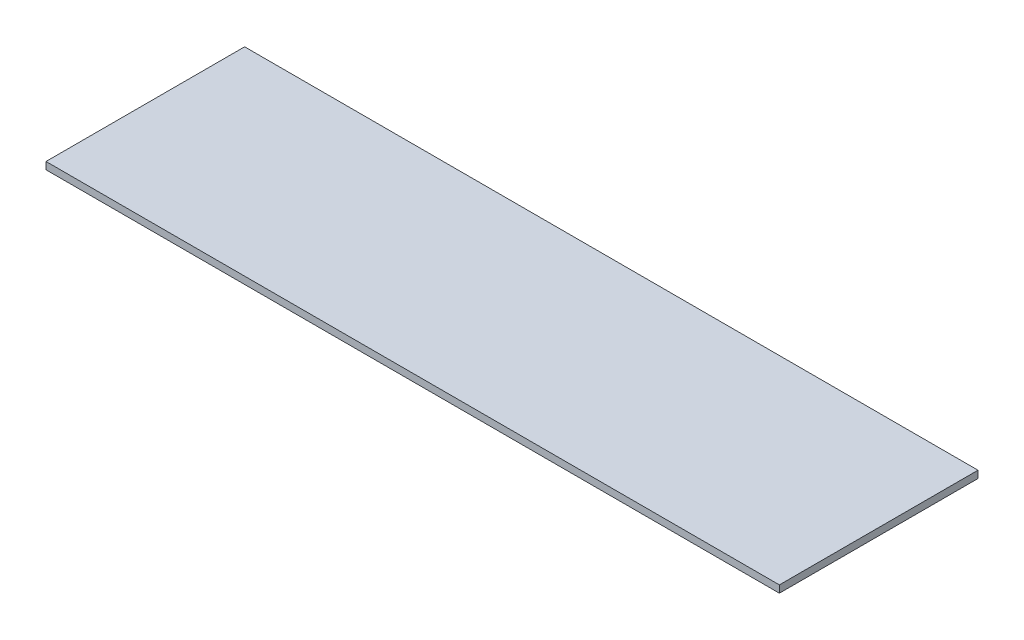
ISO-10303-21;
HEADER;
FILE_DESCRIPTION(('STEP AP214'),'2;1');
FILE_NAME('part.step','',(''),(''),'','','');
FILE_SCHEMA(('AUTOMOTIVE_DESIGN { 1 0 10303 214 1 1 1 1 }'));
ENDSEC;
DATA;
#1=APPLICATION_CONTEXT('core data for automotive mechanical design processes');
#2=APPLICATION_PROTOCOL_DEFINITION('international standard','automotive_design',2000,#1);
#3=PRODUCT_CONTEXT('',#1,'mechanical');
#4=PRODUCT('Part','Part','',(#3));
#5=PRODUCT_RELATED_PRODUCT_CATEGORY('part','',(#4));
#6=PRODUCT_DEFINITION_FORMATION('','',#4);
#7=PRODUCT_DEFINITION_CONTEXT('part definition',#1,'design');
#8=PRODUCT_DEFINITION('design','',#6,#7);
#9=PRODUCT_DEFINITION_SHAPE('','',#8);
#10=(LENGTH_UNIT() NAMED_UNIT(*) SI_UNIT(.MILLI.,.METRE.));
#11=(NAMED_UNIT(*) PLANE_ANGLE_UNIT() SI_UNIT($,.RADIAN.));
#12=(NAMED_UNIT(*) SI_UNIT($,.STERADIAN.) SOLID_ANGLE_UNIT());
#13=UNCERTAINTY_MEASURE_WITH_UNIT(LENGTH_MEASURE(1.E-05),#10,'distance_accuracy_value','');
#14=(GEOMETRIC_REPRESENTATION_CONTEXT(3) GLOBAL_UNCERTAINTY_ASSIGNED_CONTEXT((#13)) GLOBAL_UNIT_ASSIGNED_CONTEXT((#10,
#11,#12)) REPRESENTATION_CONTEXT('',''));
#15=CARTESIAN_POINT('',(0.,0.,0.));
#16=DIRECTION('',(0.,0.,1.));
#17=DIRECTION('',(1.,0.,0.));
#18=AXIS2_PLACEMENT_3D('',#15,#16,#17);
#19=CARTESIAN_POINT('',(-304.8,6.,82.55));
#20=DIRECTION('',(1.,0.,0.));
#21=DIRECTION('',(0.,0.,-1.));
#22=AXIS2_PLACEMENT_3D('',#19,#20,#21);
#23=PLANE('',#22);
#24=DIRECTION('',(0.,0.,1.));
#25=VECTOR('',#24,1.);
#26=CARTESIAN_POINT('',(-304.8,0.,82.55));
#27=LINE('',#26,#25);
#28=CARTESIAN_POINT('',(-304.8,0.,-82.55));
#29=VERTEX_POINT('',#28);
#30=CARTESIAN_POINT('',(-304.8,0.,82.55));
#31=VERTEX_POINT('',#30);
#32=EDGE_CURVE('E98',#29,#31,#27,.T.);
#33=ORIENTED_EDGE('',*,*,#32,.T.);
#34=DIRECTION('',(0.,-1.,0.));
#35=VECTOR('',#34,1.);
#36=CARTESIAN_POINT('',(-304.8,6.,82.55));
#37=LINE('',#36,#35);
#38=CARTESIAN_POINT('',(-304.8,6.,82.55));
#39=VERTEX_POINT('',#38);
#40=EDGE_CURVE('E11',#39,#31,#37,.T.);
#41=ORIENTED_EDGE('',*,*,#40,.F.);
#42=DIRECTION('',(0.,0.,1.));
#43=VECTOR('',#42,1.);
#44=CARTESIAN_POINT('',(-304.8,6.,82.55));
#45=LINE('',#44,#43);
#46=CARTESIAN_POINT('',(-304.8,6.,-82.55));
#47=VERTEX_POINT('',#46);
#48=EDGE_CURVE('E86',#47,#39,#45,.T.);
#49=ORIENTED_EDGE('',*,*,#48,.F.);
#50=DIRECTION('',(0.,-1.,0.));
#51=VECTOR('',#50,1.);
#52=CARTESIAN_POINT('',(-304.8,6.,-82.55));
#53=LINE('',#52,#51);
#54=EDGE_CURVE('E94',#47,#29,#53,.T.);
#55=ORIENTED_EDGE('',*,*,#54,.T.);
#56=EDGE_LOOP('',(#33,#41,#49,#55));
#57=FACE_BOUND('',#56,.T.);
#58=ADVANCED_FACE('F35',(#57),#23,.F.);
#59=CARTESIAN_POINT('',(304.8,6.,82.55));
#60=DIRECTION('',(0.,0.,-1.));
#61=DIRECTION('',(-1.,0.,0.));
#62=AXIS2_PLACEMENT_3D('',#59,#60,#61);
#63=PLANE('',#62);
#64=DIRECTION('',(1.,0.,0.));
#65=VECTOR('',#64,1.);
#66=CARTESIAN_POINT('',(304.8,0.,82.55));
#67=LINE('',#66,#65);
#68=CARTESIAN_POINT('',(304.8,0.,82.55));
#69=VERTEX_POINT('',#68);
#70=EDGE_CURVE('E90',#31,#69,#67,.T.);
#71=ORIENTED_EDGE('',*,*,#70,.T.);
#72=DIRECTION('',(0.,-1.,0.));
#73=VECTOR('',#72,1.);
#74=CARTESIAN_POINT('',(304.8,6.,82.55));
#75=LINE('',#74,#73);
#76=CARTESIAN_POINT('',(304.8,6.,82.55));
#77=VERTEX_POINT('',#76);
#78=EDGE_CURVE('E43',#77,#69,#75,.T.);
#79=ORIENTED_EDGE('',*,*,#78,.F.);
#80=DIRECTION('',(1.,0.,0.));
#81=VECTOR('',#80,1.);
#82=CARTESIAN_POINT('',(304.8,6.,82.55));
#83=LINE('',#82,#81);
#84=EDGE_CURVE('E81',#39,#77,#83,.T.);
#85=ORIENTED_EDGE('',*,*,#84,.F.);
#86=ORIENTED_EDGE('',*,*,#40,.T.);
#87=EDGE_LOOP('',(#71,#79,#85,#86));
#88=FACE_BOUND('',#87,.T.);
#89=ADVANCED_FACE('F89',(#88),#63,.F.);
#90=CARTESIAN_POINT('',(304.8,6.,82.55));
#91=DIRECTION('',(-1.,0.,0.));
#92=DIRECTION('',(0.,0.,1.));
#93=AXIS2_PLACEMENT_3D('',#90,#91,#92);
#94=PLANE('',#93);
#95=DIRECTION('',(0.,0.,-1.));
#96=VECTOR('',#95,1.);
#97=CARTESIAN_POINT('',(304.8,0.,82.55));
#98=LINE('',#97,#96);
#99=CARTESIAN_POINT('',(304.8,0.,-82.55));
#100=VERTEX_POINT('',#99);
#101=EDGE_CURVE('E68',#69,#100,#98,.T.);
#102=ORIENTED_EDGE('',*,*,#101,.T.);
#103=DIRECTION('',(0.,-1.,0.));
#104=VECTOR('',#103,1.);
#105=CARTESIAN_POINT('',(304.8,6.,-82.55));
#106=LINE('',#105,#104);
#107=CARTESIAN_POINT('',(304.8,6.,-82.55));
#108=VERTEX_POINT('',#107);
#109=EDGE_CURVE('E91',#108,#100,#106,.T.);
#110=ORIENTED_EDGE('',*,*,#109,.F.);
#111=DIRECTION('',(0.,0.,-1.));
#112=VECTOR('',#111,1.);
#113=CARTESIAN_POINT('',(304.8,6.,82.55));
#114=LINE('',#113,#112);
#115=EDGE_CURVE('E84',#77,#108,#114,.T.);
#116=ORIENTED_EDGE('',*,*,#115,.F.);
#117=ORIENTED_EDGE('',*,*,#78,.T.);
#118=EDGE_LOOP('',(#102,#110,#116,#117));
#119=FACE_BOUND('',#118,.T.);
#120=ADVANCED_FACE('F92',(#119),#94,.F.);
#121=CARTESIAN_POINT('',(304.8,6.,-82.55));
#122=DIRECTION('',(0.,0.,1.));
#123=DIRECTION('',(1.,0.,0.));
#124=AXIS2_PLACEMENT_3D('',#121,#122,#123);
#125=PLANE('',#124);
#126=DIRECTION('',(-1.,0.,0.));
#127=VECTOR('',#126,1.);
#128=CARTESIAN_POINT('',(304.8,0.,-82.55));
#129=LINE('',#128,#127);
#130=EDGE_CURVE('E74',#100,#29,#129,.T.);
#131=ORIENTED_EDGE('',*,*,#130,.T.);
#132=ORIENTED_EDGE('',*,*,#54,.F.);
#133=DIRECTION('',(-1.,0.,0.));
#134=VECTOR('',#133,1.);
#135=CARTESIAN_POINT('',(304.8,6.,-82.55));
#136=LINE('',#135,#134);
#137=EDGE_CURVE('E51',#108,#47,#136,.T.);
#138=ORIENTED_EDGE('',*,*,#137,.F.);
#139=ORIENTED_EDGE('',*,*,#109,.T.);
#140=EDGE_LOOP('',(#131,#132,#138,#139));
#141=FACE_BOUND('',#140,.T.);
#142=ADVANCED_FACE('F105',(#141),#125,.F.);
#143=CARTESIAN_POINT('',(0.,6.,0.));
#144=DIRECTION('',(0.,1.,0.));
#145=DIRECTION('',(0.,0.,1.));
#146=AXIS2_PLACEMENT_3D('',#143,#144,#145);
#147=PLANE('',#146);
#148=ORIENTED_EDGE('',*,*,#48,.T.);
#149=ORIENTED_EDGE('',*,*,#84,.T.);
#150=ORIENTED_EDGE('',*,*,#115,.T.);
#151=ORIENTED_EDGE('',*,*,#137,.T.);
#152=EDGE_LOOP('',(#148,#149,#150,#151));
#153=FACE_BOUND('',#152,.T.);
#154=ADVANCED_FACE('F82',(#153),#147,.T.);
#155=CARTESIAN_POINT('',(0.,0.,0.));
#156=DIRECTION('',(0.,1.,0.));
#157=DIRECTION('',(0.,0.,1.));
#158=AXIS2_PLACEMENT_3D('',#155,#156,#157);
#159=PLANE('',#158);
#160=ORIENTED_EDGE('',*,*,#32,.F.);
#161=ORIENTED_EDGE('',*,*,#130,.F.);
#162=ORIENTED_EDGE('',*,*,#101,.F.);
#163=ORIENTED_EDGE('',*,*,#70,.F.);
#164=EDGE_LOOP('',(#160,#161,#162,#163));
#165=FACE_BOUND('',#164,.T.);
#166=ADVANCED_FACE('F108',(#165),#159,.F.);
#167=CLOSED_SHELL('',(#58,#89,#120,#142,#154,#166));
#168=MANIFOLD_SOLID_BREP('B2',#167);
#169=ADVANCED_BREP_SHAPE_REPRESENTATION('',(#18,#168),#14);
#170=SHAPE_DEFINITION_REPRESENTATION(#9,#169);
ENDSEC;
END-ISO-10303-21;
